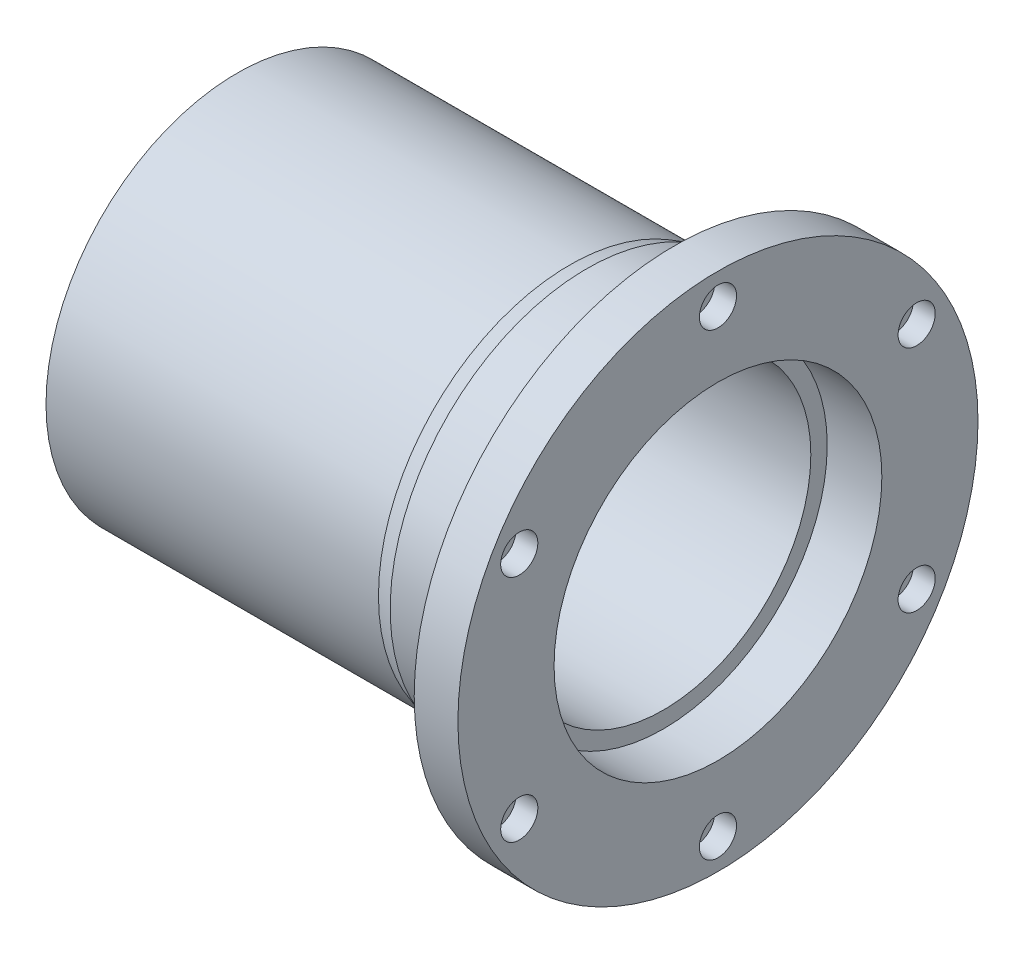
ISO-10303-21;
HEADER;
FILE_DESCRIPTION(('STEP AP214'),'2;1');
FILE_NAME('part.step','',(''),(''),'','','');
FILE_SCHEMA(('AUTOMOTIVE_DESIGN { 1 0 10303 214 1 1 1 1 }'));
ENDSEC;
DATA;
#1=APPLICATION_CONTEXT('core data for automotive mechanical design processes');
#2=APPLICATION_PROTOCOL_DEFINITION('international standard','automotive_design',2000,#1);
#3=PRODUCT_CONTEXT('',#1,'mechanical');
#4=PRODUCT('Part','Part','',(#3));
#5=PRODUCT_RELATED_PRODUCT_CATEGORY('part','',(#4));
#6=PRODUCT_DEFINITION_FORMATION('','',#4);
#7=PRODUCT_DEFINITION_CONTEXT('part definition',#1,'design');
#8=PRODUCT_DEFINITION('design','',#6,#7);
#9=PRODUCT_DEFINITION_SHAPE('','',#8);
#10=(LENGTH_UNIT() NAMED_UNIT(*) SI_UNIT(.MILLI.,.METRE.));
#11=(NAMED_UNIT(*) PLANE_ANGLE_UNIT() SI_UNIT($,.RADIAN.));
#12=(NAMED_UNIT(*) SI_UNIT($,.STERADIAN.) SOLID_ANGLE_UNIT());
#13=UNCERTAINTY_MEASURE_WITH_UNIT(LENGTH_MEASURE(1.E-05),#10,'distance_accuracy_value','');
#14=(GEOMETRIC_REPRESENTATION_CONTEXT(3) GLOBAL_UNCERTAINTY_ASSIGNED_CONTEXT((#13)) GLOBAL_UNIT_ASSIGNED_CONTEXT((#10,
#11,#12)) REPRESENTATION_CONTEXT('',''));
#15=CARTESIAN_POINT('',(0.,0.,0.));
#16=DIRECTION('',(0.,0.,1.));
#17=DIRECTION('',(1.,0.,0.));
#18=AXIS2_PLACEMENT_3D('',#15,#16,#17);
#19=CARTESIAN_POINT('',(77.6445159501331,-52.4999999999998,-90.9326673973662));
#20=DIRECTION('',(1.,0.,0.));
#21=DIRECTION('',(0.,0.,-1.));
#22=AXIS2_PLACEMENT_3D('',#19,#20,#21);
#23=CYLINDRICAL_SURFACE('',#22,5.);
#24=CARTESIAN_POINT('',(91.7866515738641,-52.4999999999998,-90.9326673973662));
#25=DIRECTION('',(1.,0.,0.));
#26=DIRECTION('',(0.,0.,-1.));
#27=AXIS2_PLACEMENT_3D('',#24,#25,#26);
#28=CIRCLE('',#27,5.);
#29=CARTESIAN_POINT('',(91.7866515738641,-52.4999999999998,-95.9326673973662));
#30=VERTEX_POINT('',#29);
#31=EDGE_CURVE('E85',#30,#30,#28,.F.);
#32=ORIENTED_EDGE('',*,*,#31,.T.);
#33=EDGE_LOOP('',(#32));
#34=FACE_BOUND('',#33,.T.);
#35=CARTESIAN_POINT('',(101.786651573864,-52.4999999999998,-90.9326673973662));
#36=DIRECTION('',(1.,0.,0.));
#37=DIRECTION('',(0.,0.,-1.));
#38=AXIS2_PLACEMENT_3D('',#35,#36,#37);
#39=CIRCLE('',#38,5.);
#40=CARTESIAN_POINT('',(101.786651573864,-52.4999999999998,-95.9326673973662));
#41=VERTEX_POINT('',#40);
#42=EDGE_CURVE('E40',#41,#41,#39,.F.);
#43=ORIENTED_EDGE('',*,*,#42,.F.);
#44=EDGE_LOOP('',(#43));
#45=FACE_BOUND('',#44,.T.);
#46=ADVANCED_FACE('F36',(#34,#45),#23,.F.);
#47=CARTESIAN_POINT('',(77.6445159501331,52.5000000000004,-90.9326673973658));
#48=DIRECTION('',(1.,0.,0.));
#49=DIRECTION('',(0.,0.,-1.));
#50=AXIS2_PLACEMENT_3D('',#47,#48,#49);
#51=CYLINDRICAL_SURFACE('',#50,5.);
#52=CARTESIAN_POINT('',(91.7866515738641,52.5000000000004,-90.9326673973658));
#53=DIRECTION('',(1.,0.,0.));
#54=DIRECTION('',(0.,0.,-1.));
#55=AXIS2_PLACEMENT_3D('',#52,#53,#54);
#56=CIRCLE('',#55,5.);
#57=CARTESIAN_POINT('',(91.7866515738641,52.5000000000004,-95.9326673973658));
#58=VERTEX_POINT('',#57);
#59=EDGE_CURVE('E89',#58,#58,#56,.F.);
#60=ORIENTED_EDGE('',*,*,#59,.T.);
#61=EDGE_LOOP('',(#60));
#62=FACE_BOUND('',#61,.T.);
#63=CARTESIAN_POINT('',(101.786651573864,52.5000000000004,-90.9326673973658));
#64=DIRECTION('',(1.,0.,0.));
#65=DIRECTION('',(0.,0.,-1.));
#66=AXIS2_PLACEMENT_3D('',#63,#64,#65);
#67=CIRCLE('',#66,5.);
#68=CARTESIAN_POINT('',(101.786651573864,52.5000000000004,-95.9326673973658));
#69=VERTEX_POINT('',#68);
#70=EDGE_CURVE('E67',#69,#69,#67,.F.);
#71=ORIENTED_EDGE('',*,*,#70,.F.);
#72=EDGE_LOOP('',(#71));
#73=FACE_BOUND('',#72,.T.);
#74=ADVANCED_FACE('F196',(#62,#73),#51,.F.);
#75=CARTESIAN_POINT('',(77.6445159501331,105.,0.));
#76=DIRECTION('',(1.,0.,0.));
#77=DIRECTION('',(0.,0.,-1.));
#78=AXIS2_PLACEMENT_3D('',#75,#76,#77);
#79=CYLINDRICAL_SURFACE('',#78,5.);
#80=CARTESIAN_POINT('',(91.7866515738641,105.,0.));
#81=DIRECTION('',(1.,0.,0.));
#82=DIRECTION('',(0.,0.,-1.));
#83=AXIS2_PLACEMENT_3D('',#80,#81,#82);
#84=CIRCLE('',#83,5.);
#85=CARTESIAN_POINT('',(91.7866515738641,105.,-5.));
#86=VERTEX_POINT('',#85);
#87=EDGE_CURVE('E81',#86,#86,#84,.F.);
#88=ORIENTED_EDGE('',*,*,#87,.T.);
#89=EDGE_LOOP('',(#88));
#90=FACE_BOUND('',#89,.T.);
#91=CARTESIAN_POINT('',(101.786651573864,105.,0.));
#92=DIRECTION('',(1.,0.,0.));
#93=DIRECTION('',(0.,0.,-1.));
#94=AXIS2_PLACEMENT_3D('',#91,#92,#93);
#95=CIRCLE('',#94,5.);
#96=CARTESIAN_POINT('',(101.786651573864,105.,-5.));
#97=VERTEX_POINT('',#96);
#98=EDGE_CURVE('E65',#97,#97,#95,.F.);
#99=ORIENTED_EDGE('',*,*,#98,.F.);
#100=EDGE_LOOP('',(#99));
#101=FACE_BOUND('',#100,.T.);
#102=ADVANCED_FACE('F202',(#90,#101),#79,.F.);
#103=CARTESIAN_POINT('',(77.6445159501331,52.4999999999992,90.9326673973665));
#104=DIRECTION('',(1.,0.,0.));
#105=DIRECTION('',(0.,0.,-1.));
#106=AXIS2_PLACEMENT_3D('',#103,#104,#105);
#107=CYLINDRICAL_SURFACE('',#106,5.);
#108=CARTESIAN_POINT('',(91.7866515738641,52.4999999999992,90.9326673973665));
#109=DIRECTION('',(1.,0.,0.));
#110=DIRECTION('',(0.,0.,-1.));
#111=AXIS2_PLACEMENT_3D('',#108,#109,#110);
#112=CIRCLE('',#111,5.);
#113=CARTESIAN_POINT('',(91.7866515738641,52.4999999999992,85.9326673973665));
#114=VERTEX_POINT('',#113);
#115=EDGE_CURVE('E76',#114,#114,#112,.F.);
#116=ORIENTED_EDGE('',*,*,#115,.T.);
#117=EDGE_LOOP('',(#116));
#118=FACE_BOUND('',#117,.T.);
#119=CARTESIAN_POINT('',(101.786651573864,52.4999999999992,90.9326673973665));
#120=DIRECTION('',(1.,0.,0.));
#121=DIRECTION('',(0.,0.,-1.));
#122=AXIS2_PLACEMENT_3D('',#119,#120,#121);
#123=CIRCLE('',#122,5.);
#124=CARTESIAN_POINT('',(101.786651573864,52.4999999999992,85.9326673973665));
#125=VERTEX_POINT('',#124);
#126=EDGE_CURVE('E61',#125,#125,#123,.F.);
#127=ORIENTED_EDGE('',*,*,#126,.F.);
#128=EDGE_LOOP('',(#127));
#129=FACE_BOUND('',#128,.T.);
#130=ADVANCED_FACE('F376',(#118,#129),#107,.F.);
#131=CARTESIAN_POINT('',(77.6445159501331,-52.5000000000011,90.9326673973654));
#132=DIRECTION('',(1.,0.,0.));
#133=DIRECTION('',(0.,0.,-1.));
#134=AXIS2_PLACEMENT_3D('',#131,#132,#133);
#135=CYLINDRICAL_SURFACE('',#134,5.);
#136=CARTESIAN_POINT('',(91.7866515738641,-52.5000000000011,90.9326673973654));
#137=DIRECTION('',(1.,0.,0.));
#138=DIRECTION('',(0.,0.,-1.));
#139=AXIS2_PLACEMENT_3D('',#136,#137,#138);
#140=CIRCLE('',#139,5.);
#141=CARTESIAN_POINT('',(91.7866515738641,-52.5000000000011,85.9326673973654));
#142=VERTEX_POINT('',#141);
#143=EDGE_CURVE('E72',#142,#142,#140,.F.);
#144=ORIENTED_EDGE('',*,*,#143,.T.);
#145=EDGE_LOOP('',(#144));
#146=FACE_BOUND('',#145,.T.);
#147=CARTESIAN_POINT('',(101.786651573864,-52.5000000000011,90.9326673973654));
#148=DIRECTION('',(1.,0.,0.));
#149=DIRECTION('',(0.,0.,-1.));
#150=AXIS2_PLACEMENT_3D('',#147,#148,#149);
#151=CIRCLE('',#150,5.);
#152=CARTESIAN_POINT('',(101.786651573864,-52.5000000000011,85.9326673973654));
#153=VERTEX_POINT('',#152);
#154=EDGE_CURVE('E58',#153,#153,#151,.F.);
#155=ORIENTED_EDGE('',*,*,#154,.F.);
#156=EDGE_LOOP('',(#155));
#157=FACE_BOUND('',#156,.T.);
#158=ADVANCED_FACE('F192',(#146,#157),#135,.F.);
#159=CARTESIAN_POINT('',(77.6445159501331,-105.,0.));
#160=DIRECTION('',(1.,0.,0.));
#161=DIRECTION('',(0.,0.,-1.));
#162=AXIS2_PLACEMENT_3D('',#159,#160,#161);
#163=CYLINDRICAL_SURFACE('',#162,5.);
#164=CARTESIAN_POINT('',(91.7866515738641,-105.,0.));
#165=DIRECTION('',(1.,0.,0.));
#166=DIRECTION('',(0.,0.,-1.));
#167=AXIS2_PLACEMENT_3D('',#164,#165,#166);
#168=CIRCLE('',#167,5.);
#169=CARTESIAN_POINT('',(91.7866515738641,-105.,-5.));
#170=VERTEX_POINT('',#169);
#171=EDGE_CURVE('E56',#170,#170,#168,.F.);
#172=ORIENTED_EDGE('',*,*,#171,.T.);
#173=EDGE_LOOP('',(#172));
#174=FACE_BOUND('',#173,.T.);
#175=CARTESIAN_POINT('',(101.786651573864,-105.,0.));
#176=DIRECTION('',(1.,0.,0.));
#177=DIRECTION('',(0.,0.,-1.));
#178=AXIS2_PLACEMENT_3D('',#175,#176,#177);
#179=CIRCLE('',#178,5.);
#180=CARTESIAN_POINT('',(101.786651573864,-105.,-5.));
#181=VERTEX_POINT('',#180);
#182=EDGE_CURVE('E53',#181,#181,#179,.F.);
#183=ORIENTED_EDGE('',*,*,#182,.F.);
#184=EDGE_LOOP('',(#183));
#185=FACE_BOUND('',#184,.T.);
#186=ADVANCED_FACE('F186',(#174,#185),#163,.F.);
#187=CARTESIAN_POINT('',(0.,0.,0.));
#188=DIRECTION('',(1.,0.,0.));
#189=DIRECTION('',(0.,0.,-1.));
#190=AXIS2_PLACEMENT_3D('',#187,#188,#189);
#191=CYLINDRICAL_SURFACE('',#190,75.);
#192=CARTESIAN_POINT('',(-108.213348426136,0.,0.));
#193=DIRECTION('',(1.,0.,0.));
#194=DIRECTION('',(0.,0.,-1.));
#195=AXIS2_PLACEMENT_3D('',#192,#193,#194);
#196=CIRCLE('',#195,75.);
#197=CARTESIAN_POINT('',(-108.213348426136,0.,-75.));
#198=VERTEX_POINT('',#197);
#199=EDGE_CURVE('E96',#198,#198,#196,.T.);
#200=ORIENTED_EDGE('',*,*,#199,.F.);
#201=EDGE_LOOP('',(#200));
#202=FACE_BOUND('',#201,.T.);
#203=CARTESIAN_POINT('',(-83.213348426136,0.,0.));
#204=DIRECTION('',(1.,0.,0.));
#205=DIRECTION('',(0.,0.,-1.));
#206=AXIS2_PLACEMENT_3D('',#203,#204,#205);
#207=CIRCLE('',#206,75.);
#208=CARTESIAN_POINT('',(-83.213348426136,0.,-75.));
#209=VERTEX_POINT('',#208);
#210=EDGE_CURVE('E10',#209,#209,#207,.T.);
#211=ORIENTED_EDGE('',*,*,#210,.T.);
#212=EDGE_LOOP('',(#211));
#213=FACE_BOUND('',#212,.T.);
#214=ADVANCED_FACE('F38',(#202,#213),#191,.F.);
#215=CARTESIAN_POINT('',(-83.213348426136,0.,0.));
#216=DIRECTION('',(1.,0.,0.));
#217=DIRECTION('',(0.,0.,-1.));
#218=AXIS2_PLACEMENT_3D('',#215,#216,#217);
#219=PLANE('',#218);
#220=ORIENTED_EDGE('',*,*,#210,.F.);
#221=EDGE_LOOP('',(#220));
#222=FACE_BOUND('',#221,.T.);
#223=CARTESIAN_POINT('',(-83.213348426136,0.,0.));
#224=DIRECTION('',(1.,0.,0.));
#225=DIRECTION('',(0.,0.,-1.));
#226=AXIS2_PLACEMENT_3D('',#223,#224,#225);
#227=CIRCLE('',#226,67.5);
#228=CARTESIAN_POINT('',(-83.213348426136,0.,-67.5));
#229=VERTEX_POINT('',#228);
#230=EDGE_CURVE('E44',#229,#229,#227,.T.);
#231=ORIENTED_EDGE('',*,*,#230,.T.);
#232=EDGE_LOOP('',(#231));
#233=FACE_BOUND('',#232,.T.);
#234=ADVANCED_FACE('F185',(#222,#233),#219,.F.);
#235=CARTESIAN_POINT('',(0.,0.,0.));
#236=DIRECTION('',(1.,0.,0.));
#237=DIRECTION('',(0.,0.,-1.));
#238=AXIS2_PLACEMENT_3D('',#235,#236,#237);
#239=CYLINDRICAL_SURFACE('',#238,67.5);
#240=ORIENTED_EDGE('',*,*,#230,.F.);
#241=EDGE_LOOP('',(#240));
#242=FACE_BOUND('',#241,.T.);
#243=CARTESIAN_POINT('',(86.7866515738641,0.,0.));
#244=DIRECTION('',(1.,0.,0.));
#245=DIRECTION('',(0.,0.,-1.));
#246=AXIS2_PLACEMENT_3D('',#243,#244,#245);
#247=CIRCLE('',#246,67.5);
#248=CARTESIAN_POINT('',(86.7866515738641,0.,-67.5));
#249=VERTEX_POINT('',#248);
#250=EDGE_CURVE('E49',#249,#249,#247,.T.);
#251=ORIENTED_EDGE('',*,*,#250,.T.);
#252=EDGE_LOOP('',(#251));
#253=FACE_BOUND('',#252,.T.);
#254=ADVANCED_FACE('F125',(#242,#253),#239,.F.);
#255=CARTESIAN_POINT('',(86.7866515738641,0.,0.));
#256=DIRECTION('',(-1.,0.,0.));
#257=DIRECTION('',(0.,0.,1.));
#258=AXIS2_PLACEMENT_3D('',#255,#256,#257);
#259=PLANE('',#258);
#260=ORIENTED_EDGE('',*,*,#250,.F.);
#261=EDGE_LOOP('',(#260));
#262=FACE_BOUND('',#261,.T.);
#263=CARTESIAN_POINT('',(86.7866515738641,0.,0.));
#264=DIRECTION('',(1.,0.,0.));
#265=DIRECTION('',(0.,0.,-1.));
#266=AXIS2_PLACEMENT_3D('',#263,#264,#265);
#267=CIRCLE('',#266,75.);
#268=CARTESIAN_POINT('',(86.7866515738641,0.,-75.));
#269=VERTEX_POINT('',#268);
#270=EDGE_CURVE('E120',#269,#269,#267,.T.);
#271=ORIENTED_EDGE('',*,*,#270,.T.);
#272=EDGE_LOOP('',(#271));
#273=FACE_BOUND('',#272,.T.);
#274=ADVANCED_FACE('F127',(#262,#273),#259,.F.);
#275=CARTESIAN_POINT('',(0.,0.,0.));
#276=DIRECTION('',(1.,0.,0.));
#277=DIRECTION('',(0.,0.,-1.));
#278=AXIS2_PLACEMENT_3D('',#275,#276,#277);
#279=CYLINDRICAL_SURFACE('',#278,75.);
#280=ORIENTED_EDGE('',*,*,#270,.F.);
#281=EDGE_LOOP('',(#280));
#282=FACE_BOUND('',#281,.T.);
#283=CARTESIAN_POINT('',(111.786651573864,0.,0.));
#284=DIRECTION('',(1.,0.,0.));
#285=DIRECTION('',(0.,0.,-1.));
#286=AXIS2_PLACEMENT_3D('',#283,#284,#285);
#287=CIRCLE('',#286,75.);
#288=CARTESIAN_POINT('',(111.786651573864,0.,-75.));
#289=VERTEX_POINT('',#288);
#290=EDGE_CURVE('E117',#289,#289,#287,.T.);
#291=ORIENTED_EDGE('',*,*,#290,.T.);
#292=EDGE_LOOP('',(#291));
#293=FACE_BOUND('',#292,.T.);
#294=ADVANCED_FACE('F130',(#282,#293),#279,.F.);
#295=CARTESIAN_POINT('',(111.786651573864,0.,0.));
#296=DIRECTION('',(-1.,0.,0.));
#297=DIRECTION('',(0.,0.,1.));
#298=AXIS2_PLACEMENT_3D('',#295,#296,#297);
#299=PLANE('',#298);
#300=CARTESIAN_POINT('',(111.786651573864,-52.5000000000011,90.9326673973654));
#301=DIRECTION('',(1.,0.,0.));
#302=DIRECTION('',(0.,-0.866025403784433,-0.50000000000001));
#303=AXIS2_PLACEMENT_3D('',#300,#301,#302);
#304=CIRCLE('',#303,8.5);
#305=CARTESIAN_POINT('',(111.786651573864,-59.8612159321687,86.6826673973653));
#306=VERTEX_POINT('',#305);
#307=EDGE_CURVE('E484',#306,#306,#304,.T.);
#308=ORIENTED_EDGE('',*,*,#307,.F.);
#309=EDGE_LOOP('',(#308));
#310=FACE_BOUND('',#309,.T.);
#311=CARTESIAN_POINT('',(111.786651573864,52.4999999999992,90.9326673973665));
#312=DIRECTION('',(1.,0.,0.));
#313=DIRECTION('',(0.,-0.866025403784443,0.499999999999992));
#314=AXIS2_PLACEMENT_3D('',#311,#312,#313);
#315=CIRCLE('',#314,8.5);
#316=CARTESIAN_POINT('',(111.786651573864,45.1387840678314,95.1826673973665));
#317=VERTEX_POINT('',#316);
#318=EDGE_CURVE('E490',#317,#317,#315,.T.);
#319=ORIENTED_EDGE('',*,*,#318,.F.);
#320=EDGE_LOOP('',(#319));
#321=FACE_BOUND('',#320,.T.);
#322=CARTESIAN_POINT('',(111.786651573864,105.,0.));
#323=DIRECTION('',(1.,0.,0.));
#324=DIRECTION('',(0.,0.,1.));
#325=AXIS2_PLACEMENT_3D('',#322,#323,#324);
#326=CIRCLE('',#325,8.5);
#327=CARTESIAN_POINT('',(111.786651573864,105.,8.5));
#328=VERTEX_POINT('',#327);
#329=EDGE_CURVE('E496',#328,#328,#326,.T.);
#330=ORIENTED_EDGE('',*,*,#329,.F.);
#331=EDGE_LOOP('',(#330));
#332=FACE_BOUND('',#331,.T.);
#333=CARTESIAN_POINT('',(111.786651573864,52.5000000000004,-90.9326673973658));
#334=DIRECTION('',(1.,0.,0.));
#335=DIRECTION('',(0.,0.866025403784436,0.500000000000004));
#336=AXIS2_PLACEMENT_3D('',#333,#334,#335);
#337=CIRCLE('',#336,8.5);
#338=CARTESIAN_POINT('',(111.786651573864,59.8612159321681,-86.6826673973658));
#339=VERTEX_POINT('',#338);
#340=EDGE_CURVE('E502',#339,#339,#337,.T.);
#341=ORIENTED_EDGE('',*,*,#340,.F.);
#342=EDGE_LOOP('',(#341));
#343=FACE_BOUND('',#342,.T.);
#344=CARTESIAN_POINT('',(111.786651573864,-52.4999999999998,-90.9326673973662));
#345=DIRECTION('',(1.,0.,0.));
#346=DIRECTION('',(0.,0.86602540378444,-0.499999999999998));
#347=AXIS2_PLACEMENT_3D('',#344,#345,#346);
#348=CIRCLE('',#347,8.5);
#349=CARTESIAN_POINT('',(111.786651573864,-45.138784067832,-95.1826673973662));
#350=VERTEX_POINT('',#349);
#351=EDGE_CURVE('E478',#350,#350,#348,.T.);
#352=ORIENTED_EDGE('',*,*,#351,.F.);
#353=EDGE_LOOP('',(#352));
#354=FACE_BOUND('',#353,.T.);
#355=CARTESIAN_POINT('',(111.786651573864,-105.,0.));
#356=DIRECTION('',(1.,0.,0.));
#357=DIRECTION('',(0.,0.,-1.));
#358=AXIS2_PLACEMENT_3D('',#355,#356,#357);
#359=CIRCLE('',#358,8.5);
#360=CARTESIAN_POINT('',(111.786651573864,-105.,-8.5));
#361=VERTEX_POINT('',#360);
#362=EDGE_CURVE('E88',#361,#361,#359,.T.);
#363=ORIENTED_EDGE('',*,*,#362,.F.);
#364=EDGE_LOOP('',(#363));
#365=FACE_BOUND('',#364,.T.);
#366=ORIENTED_EDGE('',*,*,#290,.F.);
#367=EDGE_LOOP('',(#366));
#368=FACE_BOUND('',#367,.T.);
#369=CARTESIAN_POINT('',(111.786651573864,0.,0.));
#370=DIRECTION('',(1.,0.,0.));
#371=DIRECTION('',(0.,0.,-1.));
#372=AXIS2_PLACEMENT_3D('',#369,#370,#371);
#373=CIRCLE('',#372,119.);
#374=CARTESIAN_POINT('',(111.786651573864,0.,-119.));
#375=VERTEX_POINT('',#374);
#376=EDGE_CURVE('E114',#375,#375,#373,.T.);
#377=ORIENTED_EDGE('',*,*,#376,.T.);
#378=EDGE_LOOP('',(#377));
#379=FACE_BOUND('',#378,.T.);
#380=ADVANCED_FACE('F136',(#310,#321,#332,#343,#354,#365,#368,#379),#299,.F.);
#381=CARTESIAN_POINT('',(0.,0.,0.));
#382=DIRECTION('',(1.,0.,0.));
#383=DIRECTION('',(0.,0.,-1.));
#384=AXIS2_PLACEMENT_3D('',#381,#382,#383);
#385=CYLINDRICAL_SURFACE('',#384,119.);
#386=ORIENTED_EDGE('',*,*,#376,.F.);
#387=EDGE_LOOP('',(#386));
#388=FACE_BOUND('',#387,.T.);
#389=CARTESIAN_POINT('',(91.7866515738641,0.,0.));
#390=DIRECTION('',(1.,0.,0.));
#391=DIRECTION('',(0.,0.,-1.));
#392=AXIS2_PLACEMENT_3D('',#389,#390,#391);
#393=CIRCLE('',#392,119.);
#394=CARTESIAN_POINT('',(91.7866515738641,0.,-119.));
#395=VERTEX_POINT('',#394);
#396=EDGE_CURVE('E111',#395,#395,#393,.T.);
#397=ORIENTED_EDGE('',*,*,#396,.T.);
#398=EDGE_LOOP('',(#397));
#399=FACE_BOUND('',#398,.T.);
#400=ADVANCED_FACE('F142',(#388,#399),#385,.T.);
#401=CARTESIAN_POINT('',(91.7866515738641,0.,0.));
#402=DIRECTION('',(1.,0.,0.));
#403=DIRECTION('',(0.,0.,-1.));
#404=AXIS2_PLACEMENT_3D('',#401,#402,#403);
#405=PLANE('',#404);
#406=ORIENTED_EDGE('',*,*,#143,.F.);
#407=EDGE_LOOP('',(#406));
#408=FACE_BOUND('',#407,.T.);
#409=ORIENTED_EDGE('',*,*,#115,.F.);
#410=EDGE_LOOP('',(#409));
#411=FACE_BOUND('',#410,.T.);
#412=ORIENTED_EDGE('',*,*,#87,.F.);
#413=EDGE_LOOP('',(#412));
#414=FACE_BOUND('',#413,.T.);
#415=ORIENTED_EDGE('',*,*,#59,.F.);
#416=EDGE_LOOP('',(#415));
#417=FACE_BOUND('',#416,.T.);
#418=ORIENTED_EDGE('',*,*,#31,.F.);
#419=EDGE_LOOP('',(#418));
#420=FACE_BOUND('',#419,.T.);
#421=ORIENTED_EDGE('',*,*,#171,.F.);
#422=EDGE_LOOP('',(#421));
#423=FACE_BOUND('',#422,.T.);
#424=ORIENTED_EDGE('',*,*,#396,.F.);
#425=EDGE_LOOP('',(#424));
#426=FACE_BOUND('',#425,.T.);
#427=CARTESIAN_POINT('',(91.7866515738641,0.,0.));
#428=DIRECTION('',(1.,0.,0.));
#429=DIRECTION('',(0.,0.,-1.));
#430=AXIS2_PLACEMENT_3D('',#427,#428,#429);
#431=CIRCLE('',#430,90.);
#432=CARTESIAN_POINT('',(91.7866515738641,0.,-90.));
#433=VERTEX_POINT('',#432);
#434=EDGE_CURVE('E108',#433,#433,#431,.T.);
#435=ORIENTED_EDGE('',*,*,#434,.T.);
#436=EDGE_LOOP('',(#435));
#437=FACE_BOUND('',#436,.T.);
#438=ADVANCED_FACE('F149',(#408,#411,#414,#417,#420,#423,#426,#437),#405,.F.);
#439=CARTESIAN_POINT('',(0.,0.,0.));
#440=DIRECTION('',(1.,0.,0.));
#441=DIRECTION('',(0.,0.,-1.));
#442=AXIS2_PLACEMENT_3D('',#439,#440,#441);
#443=CYLINDRICAL_SURFACE('',#442,90.);
#444=ORIENTED_EDGE('',*,*,#434,.F.);
#445=EDGE_LOOP('',(#444));
#446=FACE_BOUND('',#445,.T.);
#447=CARTESIAN_POINT('',(51.7866515738641,0.,0.));
#448=DIRECTION('',(1.,0.,0.));
#449=DIRECTION('',(0.,0.,-1.));
#450=AXIS2_PLACEMENT_3D('',#447,#448,#449);
#451=CIRCLE('',#450,90.);
#452=CARTESIAN_POINT('',(51.7866515738641,0.,-90.));
#453=VERTEX_POINT('',#452);
#454=EDGE_CURVE('E105',#453,#453,#451,.T.);
#455=ORIENTED_EDGE('',*,*,#454,.T.);
#456=EDGE_LOOP('',(#455));
#457=FACE_BOUND('',#456,.T.);
#458=ADVANCED_FACE('F155',(#446,#457),#443,.T.);
#459=CARTESIAN_POINT('',(43.9264182715702,0.,0.));
#460=DIRECTION('',(1.,0.,0.));
#461=DIRECTION('',(0.,0.,-1.));
#462=AXIS2_PLACEMENT_3D('',#459,#460,#461);
#463=CONICAL_SURFACE('',#462,87.5,0.307939176712924);
#464=ORIENTED_EDGE('',*,*,#454,.F.);
#465=EDGE_LOOP('',(#464));
#466=FACE_BOUND('',#465,.T.);
#467=CARTESIAN_POINT('',(43.9264182715702,0.,0.));
#468=DIRECTION('',(1.,0.,0.));
#469=DIRECTION('',(0.,0.,-1.));
#470=AXIS2_PLACEMENT_3D('',#467,#468,#469);
#471=CIRCLE('',#470,87.5);
#472=CARTESIAN_POINT('',(43.9264182715702,0.,-87.5));
#473=VERTEX_POINT('',#472);
#474=EDGE_CURVE('E102',#473,#473,#471,.T.);
#475=ORIENTED_EDGE('',*,*,#474,.T.);
#476=EDGE_LOOP('',(#475));
#477=FACE_BOUND('',#476,.T.);
#478=ADVANCED_FACE('F162',(#466,#477),#463,.T.);
#479=CARTESIAN_POINT('',(0.,0.,0.));
#480=DIRECTION('',(1.,0.,0.));
#481=DIRECTION('',(0.,0.,-1.));
#482=AXIS2_PLACEMENT_3D('',#479,#480,#481);
#483=CYLINDRICAL_SURFACE('',#482,87.5);
#484=ORIENTED_EDGE('',*,*,#474,.F.);
#485=EDGE_LOOP('',(#484));
#486=FACE_BOUND('',#485,.T.);
#487=CARTESIAN_POINT('',(-108.213348426136,0.,0.));
#488=DIRECTION('',(1.,0.,0.));
#489=DIRECTION('',(0.,0.,-1.));
#490=AXIS2_PLACEMENT_3D('',#487,#488,#489);
#491=CIRCLE('',#490,87.5);
#492=CARTESIAN_POINT('',(-108.213348426136,0.,-87.5));
#493=VERTEX_POINT('',#492);
#494=EDGE_CURVE('E99',#493,#493,#491,.T.);
#495=ORIENTED_EDGE('',*,*,#494,.T.);
#496=EDGE_LOOP('',(#495));
#497=FACE_BOUND('',#496,.T.);
#498=ADVANCED_FACE('F168',(#486,#497),#483,.T.);
#499=CARTESIAN_POINT('',(-108.213348426136,0.,0.));
#500=DIRECTION('',(1.,0.,0.));
#501=DIRECTION('',(0.,0.,-1.));
#502=AXIS2_PLACEMENT_3D('',#499,#500,#501);
#503=PLANE('',#502);
#504=ORIENTED_EDGE('',*,*,#494,.F.);
#505=EDGE_LOOP('',(#504));
#506=FACE_BOUND('',#505,.T.);
#507=ORIENTED_EDGE('',*,*,#199,.T.);
#508=EDGE_LOOP('',(#507));
#509=FACE_BOUND('',#508,.T.);
#510=ADVANCED_FACE('F174',(#506,#509),#503,.F.);
#511=CARTESIAN_POINT('',(101.786651573864,-105.,0.));
#512=DIRECTION('',(1.,0.,0.));
#513=DIRECTION('',(0.,0.,-1.));
#514=AXIS2_PLACEMENT_3D('',#511,#512,#513);
#515=PLANE('',#514);
#516=CARTESIAN_POINT('',(101.786651573864,-105.,0.));
#517=DIRECTION('',(1.,0.,0.));
#518=DIRECTION('',(0.,0.,-1.));
#519=AXIS2_PLACEMENT_3D('',#516,#517,#518);
#520=CIRCLE('',#519,8.5);
#521=CARTESIAN_POINT('',(101.786651573864,-105.,-8.5));
#522=VERTEX_POINT('',#521);
#523=EDGE_CURVE('E57',#522,#522,#520,.T.);
#524=ORIENTED_EDGE('',*,*,#523,.T.);
#525=EDGE_LOOP('',(#524));
#526=FACE_BOUND('',#525,.T.);
#527=ORIENTED_EDGE('',*,*,#182,.T.);
#528=EDGE_LOOP('',(#527));
#529=FACE_BOUND('',#528,.T.);
#530=ADVANCED_FACE('F180',(#526,#529),#515,.T.);
#531=CARTESIAN_POINT('',(101.786651573864,-105.,0.));
#532=DIRECTION('',(1.,0.,0.));
#533=DIRECTION('',(0.,0.,-1.));
#534=AXIS2_PLACEMENT_3D('',#531,#532,#533);
#535=CYLINDRICAL_SURFACE('',#534,8.5);
#536=ORIENTED_EDGE('',*,*,#523,.F.);
#537=EDGE_LOOP('',(#536));
#538=FACE_BOUND('',#537,.T.);
#539=ORIENTED_EDGE('',*,*,#362,.T.);
#540=EDGE_LOOP('',(#539));
#541=FACE_BOUND('',#540,.T.);
#542=ADVANCED_FACE('F211',(#538,#541),#535,.F.);
#543=CARTESIAN_POINT('',(101.786651573864,-52.5000000000011,90.9326673973654));
#544=DIRECTION('',(1.,0.,0.));
#545=DIRECTION('',(0.,-0.866025403784433,-0.50000000000001));
#546=AXIS2_PLACEMENT_3D('',#543,#544,#545);
#547=PLANE('',#546);
#548=CARTESIAN_POINT('',(101.786651573864,-52.5000000000011,90.9326673973654));
#549=DIRECTION('',(1.,0.,0.));
#550=DIRECTION('',(0.,-0.866025403784433,-0.50000000000001));
#551=AXIS2_PLACEMENT_3D('',#548,#549,#550);
#552=CIRCLE('',#551,8.5);
#553=CARTESIAN_POINT('',(101.786651573864,-59.8612159321687,86.6826673973653));
#554=VERTEX_POINT('',#553);
#555=EDGE_CURVE('E487',#554,#554,#552,.T.);
#556=ORIENTED_EDGE('',*,*,#555,.T.);
#557=EDGE_LOOP('',(#556));
#558=FACE_BOUND('',#557,.T.);
#559=ORIENTED_EDGE('',*,*,#154,.T.);
#560=EDGE_LOOP('',(#559));
#561=FACE_BOUND('',#560,.T.);
#562=ADVANCED_FACE('F214',(#558,#561),#547,.T.);
#563=CARTESIAN_POINT('',(101.786651573864,-52.5000000000011,90.9326673973654));
#564=DIRECTION('',(1.,0.,0.));
#565=DIRECTION('',(0.,0.,-1.));
#566=AXIS2_PLACEMENT_3D('',#563,#564,#565);
#567=CYLINDRICAL_SURFACE('',#566,8.5);
#568=ORIENTED_EDGE('',*,*,#555,.F.);
#569=EDGE_LOOP('',(#568));
#570=FACE_BOUND('',#569,.T.);
#571=ORIENTED_EDGE('',*,*,#307,.T.);
#572=EDGE_LOOP('',(#571));
#573=FACE_BOUND('',#572,.T.);
#574=ADVANCED_FACE('F266',(#570,#573),#567,.F.);
#575=CARTESIAN_POINT('',(101.786651573864,52.4999999999992,90.9326673973665));
#576=DIRECTION('',(1.,0.,0.));
#577=DIRECTION('',(0.,-0.866025403784443,0.499999999999992));
#578=AXIS2_PLACEMENT_3D('',#575,#576,#577);
#579=PLANE('',#578);
#580=CARTESIAN_POINT('',(101.786651573864,52.4999999999992,90.9326673973665));
#581=DIRECTION('',(1.,0.,0.));
#582=DIRECTION('',(0.,-0.866025403784443,0.499999999999992));
#583=AXIS2_PLACEMENT_3D('',#580,#581,#582);
#584=CIRCLE('',#583,8.5);
#585=CARTESIAN_POINT('',(101.786651573864,45.1387840678314,95.1826673973665));
#586=VERTEX_POINT('',#585);
#587=EDGE_CURVE('E493',#586,#586,#584,.T.);
#588=ORIENTED_EDGE('',*,*,#587,.T.);
#589=EDGE_LOOP('',(#588));
#590=FACE_BOUND('',#589,.T.);
#591=ORIENTED_EDGE('',*,*,#126,.T.);
#592=EDGE_LOOP('',(#591));
#593=FACE_BOUND('',#592,.T.);
#594=ADVANCED_FACE('F274',(#590,#593),#579,.T.);
#595=CARTESIAN_POINT('',(101.786651573864,52.4999999999992,90.9326673973665));
#596=DIRECTION('',(1.,0.,0.));
#597=DIRECTION('',(0.,0.,-1.));
#598=AXIS2_PLACEMENT_3D('',#595,#596,#597);
#599=CYLINDRICAL_SURFACE('',#598,8.5);
#600=ORIENTED_EDGE('',*,*,#587,.F.);
#601=EDGE_LOOP('',(#600));
#602=FACE_BOUND('',#601,.T.);
#603=ORIENTED_EDGE('',*,*,#318,.T.);
#604=EDGE_LOOP('',(#603));
#605=FACE_BOUND('',#604,.T.);
#606=ADVANCED_FACE('F282',(#602,#605),#599,.F.);
#607=CARTESIAN_POINT('',(101.786651573864,105.,0.));
#608=DIRECTION('',(1.,0.,0.));
#609=DIRECTION('',(0.,0.,1.));
#610=AXIS2_PLACEMENT_3D('',#607,#608,#609);
#611=PLANE('',#610);
#612=CARTESIAN_POINT('',(101.786651573864,105.,0.));
#613=DIRECTION('',(1.,0.,0.));
#614=DIRECTION('',(0.,0.,1.));
#615=AXIS2_PLACEMENT_3D('',#612,#613,#614);
#616=CIRCLE('',#615,8.5);
#617=CARTESIAN_POINT('',(101.786651573864,105.,8.5));
#618=VERTEX_POINT('',#617);
#619=EDGE_CURVE('E499',#618,#618,#616,.T.);
#620=ORIENTED_EDGE('',*,*,#619,.T.);
#621=EDGE_LOOP('',(#620));
#622=FACE_BOUND('',#621,.T.);
#623=ORIENTED_EDGE('',*,*,#98,.T.);
#624=EDGE_LOOP('',(#623));
#625=FACE_BOUND('',#624,.T.);
#626=ADVANCED_FACE('F290',(#622,#625),#611,.T.);
#627=CARTESIAN_POINT('',(101.786651573864,105.,0.));
#628=DIRECTION('',(1.,0.,0.));
#629=DIRECTION('',(0.,0.,-1.));
#630=AXIS2_PLACEMENT_3D('',#627,#628,#629);
#631=CYLINDRICAL_SURFACE('',#630,8.5);
#632=ORIENTED_EDGE('',*,*,#619,.F.);
#633=EDGE_LOOP('',(#632));
#634=FACE_BOUND('',#633,.T.);
#635=ORIENTED_EDGE('',*,*,#329,.T.);
#636=EDGE_LOOP('',(#635));
#637=FACE_BOUND('',#636,.T.);
#638=ADVANCED_FACE('F298',(#634,#637),#631,.F.);
#639=CARTESIAN_POINT('',(101.786651573864,52.5000000000004,-90.9326673973658));
#640=DIRECTION('',(1.,0.,0.));
#641=DIRECTION('',(0.,0.866025403784436,0.500000000000004));
#642=AXIS2_PLACEMENT_3D('',#639,#640,#641);
#643=PLANE('',#642);
#644=CARTESIAN_POINT('',(101.786651573864,52.5000000000004,-90.9326673973658));
#645=DIRECTION('',(1.,0.,0.));
#646=DIRECTION('',(0.,0.866025403784436,0.500000000000004));
#647=AXIS2_PLACEMENT_3D('',#644,#645,#646);
#648=CIRCLE('',#647,8.5);
#649=CARTESIAN_POINT('',(101.786651573864,59.8612159321681,-86.6826673973658));
#650=VERTEX_POINT('',#649);
#651=EDGE_CURVE('E481',#650,#650,#648,.T.);
#652=ORIENTED_EDGE('',*,*,#651,.T.);
#653=EDGE_LOOP('',(#652));
#654=FACE_BOUND('',#653,.T.);
#655=ORIENTED_EDGE('',*,*,#70,.T.);
#656=EDGE_LOOP('',(#655));
#657=FACE_BOUND('',#656,.T.);
#658=ADVANCED_FACE('F306',(#654,#657),#643,.T.);
#659=CARTESIAN_POINT('',(101.786651573864,52.5000000000004,-90.9326673973658));
#660=DIRECTION('',(1.,0.,0.));
#661=DIRECTION('',(0.,0.,-1.));
#662=AXIS2_PLACEMENT_3D('',#659,#660,#661);
#663=CYLINDRICAL_SURFACE('',#662,8.5);
#664=ORIENTED_EDGE('',*,*,#651,.F.);
#665=EDGE_LOOP('',(#664));
#666=FACE_BOUND('',#665,.T.);
#667=ORIENTED_EDGE('',*,*,#340,.T.);
#668=EDGE_LOOP('',(#667));
#669=FACE_BOUND('',#668,.T.);
#670=ADVANCED_FACE('F314',(#666,#669),#663,.F.);
#671=CARTESIAN_POINT('',(101.786651573864,-52.4999999999998,-90.9326673973662));
#672=DIRECTION('',(1.,0.,0.));
#673=DIRECTION('',(0.,0.86602540378444,-0.499999999999998));
#674=AXIS2_PLACEMENT_3D('',#671,#672,#673);
#675=PLANE('',#674);
#676=CARTESIAN_POINT('',(101.786651573864,-52.4999999999998,-90.9326673973662));
#677=DIRECTION('',(1.,0.,0.));
#678=DIRECTION('',(0.,0.86602540378444,-0.499999999999998));
#679=AXIS2_PLACEMENT_3D('',#676,#677,#678);
#680=CIRCLE('',#679,8.5);
#681=CARTESIAN_POINT('',(101.786651573864,-45.138784067832,-95.1826673973662));
#682=VERTEX_POINT('',#681);
#683=EDGE_CURVE('E62',#682,#682,#680,.T.);
#684=ORIENTED_EDGE('',*,*,#683,.T.);
#685=EDGE_LOOP('',(#684));
#686=FACE_BOUND('',#685,.T.);
#687=ORIENTED_EDGE('',*,*,#42,.T.);
#688=EDGE_LOOP('',(#687));
#689=FACE_BOUND('',#688,.T.);
#690=ADVANCED_FACE('F322',(#686,#689),#675,.T.);
#691=CARTESIAN_POINT('',(101.786651573864,-52.4999999999998,-90.9326673973662));
#692=DIRECTION('',(1.,0.,0.));
#693=DIRECTION('',(0.,0.,-1.));
#694=AXIS2_PLACEMENT_3D('',#691,#692,#693);
#695=CYLINDRICAL_SURFACE('',#694,8.5);
#696=ORIENTED_EDGE('',*,*,#683,.F.);
#697=EDGE_LOOP('',(#696));
#698=FACE_BOUND('',#697,.T.);
#699=ORIENTED_EDGE('',*,*,#351,.T.);
#700=EDGE_LOOP('',(#699));
#701=FACE_BOUND('',#700,.T.);
#702=ADVANCED_FACE('F330',(#698,#701),#695,.F.);
#703=CLOSED_SHELL('',(#46,#74,#102,#130,#158,#186,#214,#234,#254,#274,#294,#380,#400,#438,#458,
#478,#498,#510,#530,#542,#562,#574,#594,#606,#626,#638,#658,#670,#690,#702));
#704=MANIFOLD_SOLID_BREP('B2',#703);
#705=ADVANCED_BREP_SHAPE_REPRESENTATION('',(#18,#704),#14);
#706=SHAPE_DEFINITION_REPRESENTATION(#9,#705);
ENDSEC;
END-ISO-10303-21;
